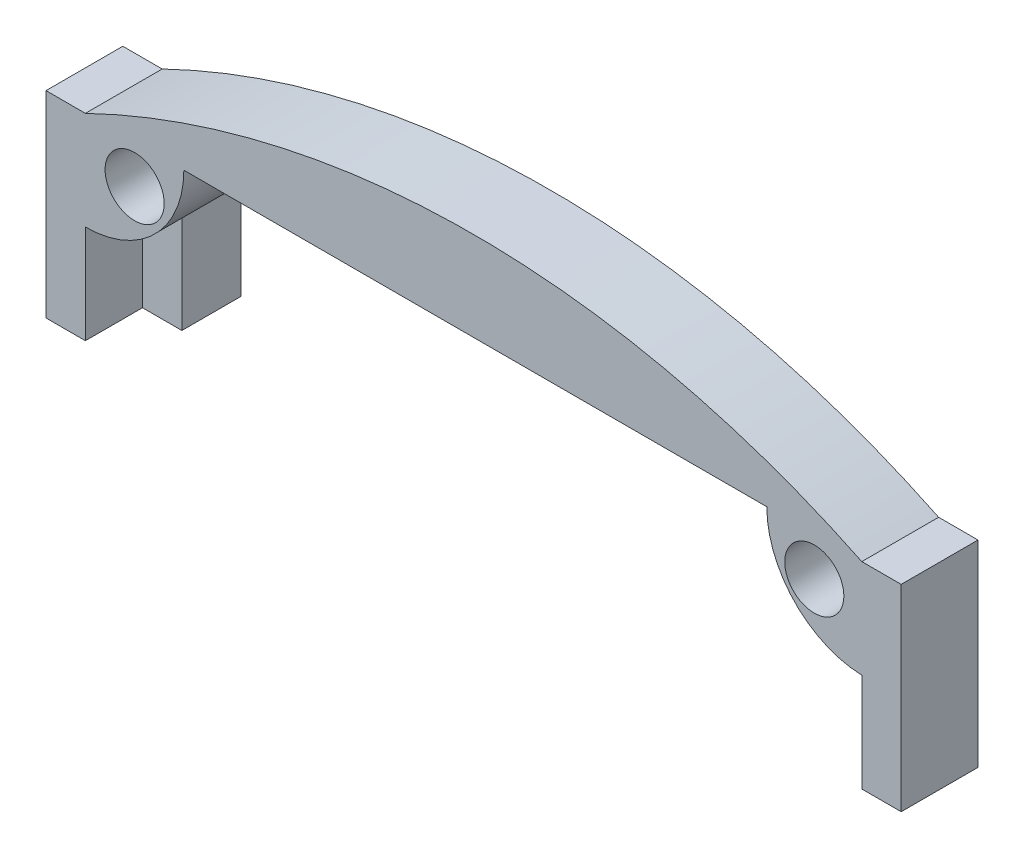
ISO-10303-21;
HEADER;
FILE_DESCRIPTION(('STEP AP214'),'2;1');
FILE_NAME('part.step','',(''),(''),'','','');
FILE_SCHEMA(('AUTOMOTIVE_DESIGN { 1 0 10303 214 1 1 1 1 }'));
ENDSEC;
DATA;
#1=APPLICATION_CONTEXT('core data for automotive mechanical design processes');
#2=APPLICATION_PROTOCOL_DEFINITION('international standard','automotive_design',2000,#1);
#3=PRODUCT_CONTEXT('',#1,'mechanical');
#4=PRODUCT('Part','Part','',(#3));
#5=PRODUCT_RELATED_PRODUCT_CATEGORY('part','',(#4));
#6=PRODUCT_DEFINITION_FORMATION('','',#4);
#7=PRODUCT_DEFINITION_CONTEXT('part definition',#1,'design');
#8=PRODUCT_DEFINITION('design','',#6,#7);
#9=PRODUCT_DEFINITION_SHAPE('','',#8);
#10=(LENGTH_UNIT() NAMED_UNIT(*) SI_UNIT(.MILLI.,.METRE.));
#11=(NAMED_UNIT(*) PLANE_ANGLE_UNIT() SI_UNIT($,.RADIAN.));
#12=(NAMED_UNIT(*) SI_UNIT($,.STERADIAN.) SOLID_ANGLE_UNIT());
#13=UNCERTAINTY_MEASURE_WITH_UNIT(LENGTH_MEASURE(1.E-05),#10,'distance_accuracy_value','');
#14=(GEOMETRIC_REPRESENTATION_CONTEXT(3) GLOBAL_UNCERTAINTY_ASSIGNED_CONTEXT((#13)) GLOBAL_UNIT_ASSIGNED_CONTEXT((#10,
#11,#12)) REPRESENTATION_CONTEXT('',''));
#15=CARTESIAN_POINT('',(0.,0.,0.));
#16=DIRECTION('',(0.,0.,1.));
#17=DIRECTION('',(1.,0.,0.));
#18=AXIS2_PLACEMENT_3D('',#15,#16,#17);
#19=CARTESIAN_POINT('',(0.,0.,-2.));
#20=DIRECTION('',(0.,0.,-1.));
#21=DIRECTION('',(-1.,0.,0.));
#22=AXIS2_PLACEMENT_3D('',#19,#20,#21);
#23=PLANE('',#22);
#24=DIRECTION('',(0.,-1.,0.));
#25=VECTOR('',#24,1.);
#26=CARTESIAN_POINT('',(2.,-5.,-2.));
#27=LINE('',#26,#25);
#28=CARTESIAN_POINT('',(2.,-5.,-2.));
#29=VERTEX_POINT('',#28);
#30=CARTESIAN_POINT('',(2.,-10.,-2.));
#31=VERTEX_POINT('',#30);
#32=EDGE_CURVE('E71',#29,#31,#27,.T.);
#33=ORIENTED_EDGE('',*,*,#32,.T.);
#34=DIRECTION('',(-1.,0.,0.));
#35=VECTOR('',#34,1.);
#36=CARTESIAN_POINT('',(2.,-10.,-2.));
#37=LINE('',#36,#35);
#38=CARTESIAN_POINT('',(0.,-10.,-2.));
#39=VERTEX_POINT('',#38);
#40=EDGE_CURVE('E13',#31,#39,#37,.T.);
#41=ORIENTED_EDGE('',*,*,#40,.T.);
#42=DIRECTION('',(0.,1.,0.));
#43=VECTOR('',#42,1.);
#44=CARTESIAN_POINT('',(0.,-10.,-2.));
#45=LINE('',#44,#43);
#46=CARTESIAN_POINT('',(0.,-5.,-2.));
#47=VERTEX_POINT('',#46);
#48=EDGE_CURVE('E100',#39,#47,#45,.T.);
#49=ORIENTED_EDGE('',*,*,#48,.T.);
#50=DIRECTION('',(1.,0.,0.));
#51=VECTOR('',#50,1.);
#52=CARTESIAN_POINT('',(0.,-5.,-2.));
#53=LINE('',#52,#51);
#54=EDGE_CURVE('E126',#47,#29,#53,.T.);
#55=ORIENTED_EDGE('',*,*,#54,.T.);
#56=EDGE_LOOP('',(#33,#41,#49,#55));
#57=FACE_BOUND('',#56,.T.);
#58=ADVANCED_FACE('F56',(#57),#23,.T.);
#59=CARTESIAN_POINT('',(2.,-5.,0.));
#60=DIRECTION('',(1.,0.,0.));
#61=DIRECTION('',(0.,0.,-1.));
#62=AXIS2_PLACEMENT_3D('',#59,#60,#61);
#63=PLANE('',#62);
#64=ORIENTED_EDGE('',*,*,#32,.F.);
#65=DIRECTION('',(0.,0.,-1.));
#66=VECTOR('',#65,1.);
#67=CARTESIAN_POINT('',(2.,-5.,0.));
#68=LINE('',#67,#66);
#69=CARTESIAN_POINT('',(2.,-5.,1.));
#70=VERTEX_POINT('',#69);
#71=EDGE_CURVE('E127',#70,#29,#68,.T.);
#72=ORIENTED_EDGE('',*,*,#71,.F.);
#73=DIRECTION('',(0.,-1.,0.));
#74=VECTOR('',#73,1.);
#75=CARTESIAN_POINT('',(2.,-5.,1.));
#76=LINE('',#75,#74);
#77=CARTESIAN_POINT('',(2.,-10.,1.));
#78=VERTEX_POINT('',#77);
#79=EDGE_CURVE('E116',#70,#78,#76,.T.);
#80=ORIENTED_EDGE('',*,*,#79,.T.);
#81=DIRECTION('',(0.,0.,-1.));
#82=VECTOR('',#81,1.);
#83=CARTESIAN_POINT('',(2.,-10.,0.));
#84=LINE('',#83,#82);
#85=EDGE_CURVE('E107',#78,#31,#84,.T.);
#86=ORIENTED_EDGE('',*,*,#85,.T.);
#87=EDGE_LOOP('',(#64,#72,#80,#86));
#88=FACE_BOUND('',#87,.T.);
#89=ADVANCED_FACE('F151',(#88),#63,.T.);
#90=CARTESIAN_POINT('',(0.,-5.,0.));
#91=DIRECTION('',(0.,1.,0.));
#92=DIRECTION('',(0.,0.,1.));
#93=AXIS2_PLACEMENT_3D('',#90,#91,#92);
#94=PLANE('',#93);
#95=ORIENTED_EDGE('',*,*,#54,.F.);
#96=DIRECTION('',(0.,0.,-1.));
#97=VECTOR('',#96,1.);
#98=CARTESIAN_POINT('',(0.,-5.,0.));
#99=LINE('',#98,#97);
#100=CARTESIAN_POINT('',(0.,-5.,1.));
#101=VERTEX_POINT('',#100);
#102=EDGE_CURVE('E138',#101,#47,#99,.T.);
#103=ORIENTED_EDGE('',*,*,#102,.F.);
#104=DIRECTION('',(1.,0.,0.));
#105=VECTOR('',#104,1.);
#106=CARTESIAN_POINT('',(0.,-5.,1.));
#107=LINE('',#106,#105);
#108=EDGE_CURVE('E114',#101,#70,#107,.T.);
#109=ORIENTED_EDGE('',*,*,#108,.T.);
#110=ORIENTED_EDGE('',*,*,#71,.T.);
#111=EDGE_LOOP('',(#95,#103,#109,#110));
#112=FACE_BOUND('',#111,.T.);
#113=ADVANCED_FACE('F149',(#112),#94,.T.);
#114=CARTESIAN_POINT('',(0.,-10.,0.));
#115=DIRECTION('',(-1.,0.,0.));
#116=DIRECTION('',(0.,0.,1.));
#117=AXIS2_PLACEMENT_3D('',#114,#115,#116);
#118=PLANE('',#117);
#119=ORIENTED_EDGE('',*,*,#48,.F.);
#120=DIRECTION('',(0.,0.,-1.));
#121=VECTOR('',#120,1.);
#122=CARTESIAN_POINT('',(0.,-10.,0.));
#123=LINE('',#122,#121);
#124=CARTESIAN_POINT('',(0.,-10.,1.));
#125=VERTEX_POINT('',#124);
#126=EDGE_CURVE('E65',#125,#39,#123,.T.);
#127=ORIENTED_EDGE('',*,*,#126,.F.);
#128=DIRECTION('',(0.,1.,0.));
#129=VECTOR('',#128,1.);
#130=CARTESIAN_POINT('',(0.,-10.,1.));
#131=LINE('',#130,#129);
#132=EDGE_CURVE('E98',#125,#101,#131,.T.);
#133=ORIENTED_EDGE('',*,*,#132,.T.);
#134=ORIENTED_EDGE('',*,*,#102,.T.);
#135=EDGE_LOOP('',(#119,#127,#133,#134));
#136=FACE_BOUND('',#135,.T.);
#137=ADVANCED_FACE('F95',(#136),#118,.T.);
#138=CARTESIAN_POINT('',(2.,-10.,0.));
#139=DIRECTION('',(0.,-1.,0.));
#140=DIRECTION('',(0.,0.,-1.));
#141=AXIS2_PLACEMENT_3D('',#138,#139,#140);
#142=PLANE('',#141);
#143=ORIENTED_EDGE('',*,*,#40,.F.);
#144=ORIENTED_EDGE('',*,*,#85,.F.);
#145=DIRECTION('',(-1.,0.,0.));
#146=VECTOR('',#145,1.);
#147=CARTESIAN_POINT('',(2.,-10.,1.));
#148=LINE('',#147,#146);
#149=EDGE_CURVE('E105',#78,#125,#148,.T.);
#150=ORIENTED_EDGE('',*,*,#149,.T.);
#151=ORIENTED_EDGE('',*,*,#126,.T.);
#152=EDGE_LOOP('',(#143,#144,#150,#151));
#153=FACE_BOUND('',#152,.T.);
#154=ADVANCED_FACE('F106',(#153),#142,.T.);
#155=CARTESIAN_POINT('',(0.,0.,1.));
#156=DIRECTION('',(0.,0.,-1.));
#157=DIRECTION('',(-1.,0.,0.));
#158=AXIS2_PLACEMENT_3D('',#155,#156,#157);
#159=PLANE('',#158);
#160=ORIENTED_EDGE('',*,*,#79,.F.);
#161=ORIENTED_EDGE('',*,*,#108,.F.);
#162=ORIENTED_EDGE('',*,*,#132,.F.);
#163=ORIENTED_EDGE('',*,*,#149,.F.);
#164=EDGE_LOOP('',(#160,#161,#162,#163));
#165=FACE_BOUND('',#164,.T.);
#166=ADVANCED_FACE('F112',(#165),#159,.F.);
#167=CLOSED_SHELL('',(#58,#89,#113,#137,#154,#166));
#168=MANIFOLD_SOLID_BREP('B2',#167);
#169=CARTESIAN_POINT('',(0.,0.,-2.));
#170=DIRECTION('',(0.,0.,-1.));
#171=DIRECTION('',(-1.,0.,0.));
#172=AXIS2_PLACEMENT_3D('',#169,#170,#171);
#173=PLANE('',#172);
#174=DIRECTION('',(0.,1.,0.));
#175=VECTOR('',#174,1.);
#176=CARTESIAN_POINT('',(39.4233040702315,-10.,-2.));
#177=LINE('',#176,#175);
#178=CARTESIAN_POINT('',(39.4233040702315,-10.,-2.));
#179=VERTEX_POINT('',#178);
#180=CARTESIAN_POINT('',(39.4233040702315,-4.99687687945213,-2.));
#181=VERTEX_POINT('',#180);
#182=EDGE_CURVE('E54',#179,#181,#177,.T.);
#183=ORIENTED_EDGE('',*,*,#182,.F.);
#184=DIRECTION('',(1.,0.,0.));
#185=VECTOR('',#184,1.);
#186=CARTESIAN_POINT('',(37.6,-10.,-2.));
#187=LINE('',#186,#185);
#188=CARTESIAN_POINT('',(37.6,-10.,-2.));
#189=VERTEX_POINT('',#188);
#190=EDGE_CURVE('E229',#189,#179,#187,.T.);
#191=ORIENTED_EDGE('',*,*,#190,.F.);
#192=DIRECTION('',(0.,-1.,0.));
#193=VECTOR('',#192,1.);
#194=CARTESIAN_POINT('',(37.6,-4.99687687945213,-2.));
#195=LINE('',#194,#193);
#196=CARTESIAN_POINT('',(37.6,-4.99687687945213,-2.));
#197=VERTEX_POINT('',#196);
#198=EDGE_CURVE('E285',#197,#189,#195,.T.);
#199=ORIENTED_EDGE('',*,*,#198,.F.);
#200=DIRECTION('',(-1.,0.,0.));
#201=VECTOR('',#200,1.);
#202=CARTESIAN_POINT('',(39.4233040702315,-4.99687687945213,-2.));
#203=LINE('',#202,#201);
#204=EDGE_CURVE('E258',#181,#197,#203,.T.);
#205=ORIENTED_EDGE('',*,*,#204,.F.);
#206=EDGE_LOOP('',(#183,#191,#199,#205));
#207=FACE_BOUND('',#206,.T.);
#208=ADVANCED_FACE('F213',(#207),#173,.T.);
#209=CARTESIAN_POINT('',(37.6,-10.,0.));
#210=DIRECTION('',(0.,1.,0.));
#211=DIRECTION('',(0.,0.,1.));
#212=AXIS2_PLACEMENT_3D('',#209,#210,#211);
#213=PLANE('',#212);
#214=ORIENTED_EDGE('',*,*,#190,.T.);
#215=DIRECTION('',(0.,0.,-1.));
#216=VECTOR('',#215,1.);
#217=CARTESIAN_POINT('',(39.4233040702315,-10.,0.));
#218=LINE('',#217,#216);
#219=CARTESIAN_POINT('',(39.4233040702315,-10.,1.));
#220=VERTEX_POINT('',#219);
#221=EDGE_CURVE('E283',#220,#179,#218,.T.);
#222=ORIENTED_EDGE('',*,*,#221,.F.);
#223=DIRECTION('',(1.,0.,0.));
#224=VECTOR('',#223,1.);
#225=CARTESIAN_POINT('',(37.6,-10.,1.));
#226=LINE('',#225,#224);
#227=CARTESIAN_POINT('',(37.6,-10.,1.));
#228=VERTEX_POINT('',#227);
#229=EDGE_CURVE('E268',#228,#220,#226,.T.);
#230=ORIENTED_EDGE('',*,*,#229,.F.);
#231=DIRECTION('',(0.,0.,-1.));
#232=VECTOR('',#231,1.);
#233=CARTESIAN_POINT('',(37.6,-10.,0.));
#234=LINE('',#233,#232);
#235=EDGE_CURVE('E286',#228,#189,#234,.T.);
#236=ORIENTED_EDGE('',*,*,#235,.T.);
#237=EDGE_LOOP('',(#214,#222,#230,#236));
#238=FACE_BOUND('',#237,.T.);
#239=ADVANCED_FACE('F304',(#238),#213,.F.);
#240=CARTESIAN_POINT('',(37.6,-4.99687687945213,0.));
#241=DIRECTION('',(1.,0.,0.));
#242=DIRECTION('',(0.,0.,-1.));
#243=AXIS2_PLACEMENT_3D('',#240,#241,#242);
#244=PLANE('',#243);
#245=ORIENTED_EDGE('',*,*,#198,.T.);
#246=ORIENTED_EDGE('',*,*,#235,.F.);
#247=DIRECTION('',(0.,-1.,0.));
#248=VECTOR('',#247,1.);
#249=CARTESIAN_POINT('',(37.6,-4.99687687945213,1.));
#250=LINE('',#249,#248);
#251=CARTESIAN_POINT('',(37.6,-4.99687687945213,1.));
#252=VERTEX_POINT('',#251);
#253=EDGE_CURVE('E273',#252,#228,#250,.T.);
#254=ORIENTED_EDGE('',*,*,#253,.F.);
#255=DIRECTION('',(0.,0.,-1.));
#256=VECTOR('',#255,1.);
#257=CARTESIAN_POINT('',(37.6,-4.99687687945213,0.));
#258=LINE('',#257,#256);
#259=EDGE_CURVE('E272',#252,#197,#258,.T.);
#260=ORIENTED_EDGE('',*,*,#259,.T.);
#261=EDGE_LOOP('',(#245,#246,#254,#260));
#262=FACE_BOUND('',#261,.T.);
#263=ADVANCED_FACE('F308',(#262),#244,.F.);
#264=CARTESIAN_POINT('',(39.4233040702315,-4.99687687945213,0.));
#265=DIRECTION('',(0.,-1.,0.));
#266=DIRECTION('',(0.,0.,-1.));
#267=AXIS2_PLACEMENT_3D('',#264,#265,#266);
#268=PLANE('',#267);
#269=ORIENTED_EDGE('',*,*,#204,.T.);
#270=ORIENTED_EDGE('',*,*,#259,.F.);
#271=DIRECTION('',(-1.,0.,0.));
#272=VECTOR('',#271,1.);
#273=CARTESIAN_POINT('',(39.4233040702315,-4.99687687945213,1.));
#274=LINE('',#273,#272);
#275=CARTESIAN_POINT('',(39.4233040702315,-4.99687687945213,1.));
#276=VERTEX_POINT('',#275);
#277=EDGE_CURVE('E265',#276,#252,#274,.T.);
#278=ORIENTED_EDGE('',*,*,#277,.F.);
#279=DIRECTION('',(0.,0.,-1.));
#280=VECTOR('',#279,1.);
#281=CARTESIAN_POINT('',(39.4233040702315,-4.99687687945213,0.));
#282=LINE('',#281,#280);
#283=EDGE_CURVE('E222',#276,#181,#282,.T.);
#284=ORIENTED_EDGE('',*,*,#283,.T.);
#285=EDGE_LOOP('',(#269,#270,#278,#284));
#286=FACE_BOUND('',#285,.T.);
#287=ADVANCED_FACE('F270',(#286),#268,.F.);
#288=CARTESIAN_POINT('',(39.4233040702315,-10.,0.));
#289=DIRECTION('',(-1.,0.,0.));
#290=DIRECTION('',(0.,0.,1.));
#291=AXIS2_PLACEMENT_3D('',#288,#289,#290);
#292=PLANE('',#291);
#293=ORIENTED_EDGE('',*,*,#182,.T.);
#294=ORIENTED_EDGE('',*,*,#283,.F.);
#295=DIRECTION('',(0.,1.,0.));
#296=VECTOR('',#295,1.);
#297=CARTESIAN_POINT('',(39.4233040702315,-10.,1.));
#298=LINE('',#297,#296);
#299=EDGE_CURVE('E253',#220,#276,#298,.T.);
#300=ORIENTED_EDGE('',*,*,#299,.F.);
#301=ORIENTED_EDGE('',*,*,#221,.T.);
#302=EDGE_LOOP('',(#293,#294,#300,#301));
#303=FACE_BOUND('',#302,.T.);
#304=ADVANCED_FACE('F252',(#303),#292,.F.);
#305=CARTESIAN_POINT('',(0.,0.,1.));
#306=DIRECTION('',(0.,0.,-1.));
#307=DIRECTION('',(-1.,0.,0.));
#308=AXIS2_PLACEMENT_3D('',#305,#306,#307);
#309=PLANE('',#308);
#310=ORIENTED_EDGE('',*,*,#299,.T.);
#311=ORIENTED_EDGE('',*,*,#277,.T.);
#312=ORIENTED_EDGE('',*,*,#253,.T.);
#313=ORIENTED_EDGE('',*,*,#229,.T.);
#314=EDGE_LOOP('',(#310,#311,#312,#313));
#315=FACE_BOUND('',#314,.T.);
#316=ADVANCED_FACE('F263',(#315),#309,.F.);
#317=CLOSED_SHELL('',(#208,#239,#263,#287,#304,#316));
#318=MANIFOLD_SOLID_BREP('B7',#317);
#319=CARTESIAN_POINT('',(19.7116520351157,-40.5877154670908,3.9));
#320=DIRECTION('',(0.,0.,-1.));
#321=DIRECTION('',(-1.,0.,0.));
#322=AXIS2_PLACEMENT_3D('',#319,#320,#321);
#323=CYLINDRICAL_SURFACE('',#322,45.1210801376807);
#324=CARTESIAN_POINT('',(19.7116520351157,-40.5877154670908,0.));
#325=DIRECTION('',(0.,0.,1.));
#326=DIRECTION('',(1.,0.,0.));
#327=AXIS2_PLACEMENT_3D('',#324,#325,#326);
#328=CIRCLE('',#327,45.1210801376807);
#329=CARTESIAN_POINT('',(0.,0.,0.));
#330=VERTEX_POINT('',#329);
#331=CARTESIAN_POINT('',(39.4233040702315,0.,0.));
#332=VERTEX_POINT('',#331);
#333=EDGE_CURVE('E464',#330,#332,#328,.F.);
#334=ORIENTED_EDGE('',*,*,#333,.F.);
#335=DIRECTION('',(0.,0.,-1.));
#336=VECTOR('',#335,1.);
#337=CARTESIAN_POINT('',(0.,0.,3.9));
#338=LINE('',#337,#336);
#339=CARTESIAN_POINT('',(0.,0.,3.9));
#340=VERTEX_POINT('',#339);
#341=EDGE_CURVE('E211',#340,#330,#338,.T.);
#342=ORIENTED_EDGE('',*,*,#341,.F.);
#343=CARTESIAN_POINT('',(19.7116520351157,-40.5877154670908,3.9));
#344=DIRECTION('',(0.,0.,1.));
#345=DIRECTION('',(1.,0.,0.));
#346=AXIS2_PLACEMENT_3D('',#343,#344,#345);
#347=CIRCLE('',#346,45.1210801376807);
#348=CARTESIAN_POINT('',(39.4233040702315,0.,3.9));
#349=VERTEX_POINT('',#348);
#350=EDGE_CURVE('E379',#340,#349,#347,.F.);
#351=ORIENTED_EDGE('',*,*,#350,.T.);
#352=DIRECTION('',(0.,0.,-1.));
#353=VECTOR('',#352,1.);
#354=CARTESIAN_POINT('',(39.4233040702315,0.,3.9));
#355=LINE('',#354,#353);
#356=EDGE_CURVE('E402',#349,#332,#355,.T.);
#357=ORIENTED_EDGE('',*,*,#356,.T.);
#358=EDGE_LOOP('',(#334,#342,#351,#357));
#359=FACE_BOUND('',#358,.T.);
#360=ADVANCED_FACE('F361',(#359),#323,.T.);
#361=CARTESIAN_POINT('',(0.,0.,3.9));
#362=DIRECTION('',(0.,0.,-1.));
#363=DIRECTION('',(-1.,0.,0.));
#364=AXIS2_PLACEMENT_3D('',#361,#362,#363);
#365=CYLINDRICAL_SURFACE('',#364,5.);
#366=CARTESIAN_POINT('',(0.,0.,0.));
#367=DIRECTION('',(0.,0.,1.));
#368=DIRECTION('',(1.,0.,0.));
#369=AXIS2_PLACEMENT_3D('',#366,#367,#368);
#370=CIRCLE('',#369,5.);
#371=CARTESIAN_POINT('',(0.,-5.,0.));
#372=VERTEX_POINT('',#371);
#373=CARTESIAN_POINT('',(5.,0.,0.));
#374=VERTEX_POINT('',#373);
#375=EDGE_CURVE('E477',#372,#374,#370,.T.);
#376=ORIENTED_EDGE('',*,*,#375,.T.);
#377=DIRECTION('',(0.,0.,-1.));
#378=VECTOR('',#377,1.);
#379=CARTESIAN_POINT('',(5.,0.,3.9));
#380=LINE('',#379,#378);
#381=CARTESIAN_POINT('',(5.,0.,3.9));
#382=VERTEX_POINT('',#381);
#383=EDGE_CURVE('E504',#382,#374,#380,.T.);
#384=ORIENTED_EDGE('',*,*,#383,.F.);
#385=CARTESIAN_POINT('',(0.,0.,3.9));
#386=DIRECTION('',(0.,0.,1.));
#387=DIRECTION('',(1.,0.,0.));
#388=AXIS2_PLACEMENT_3D('',#385,#386,#387);
#389=CIRCLE('',#388,5.);
#390=CARTESIAN_POINT('',(0.,-5.,3.9));
#391=VERTEX_POINT('',#390);
#392=EDGE_CURVE('E410',#391,#382,#389,.T.);
#393=ORIENTED_EDGE('',*,*,#392,.F.);
#394=DIRECTION('',(0.,0.,-1.));
#395=VECTOR('',#394,1.);
#396=CARTESIAN_POINT('',(0.,-5.,3.9));
#397=LINE('',#396,#395);
#398=EDGE_CURVE('E371',#391,#372,#397,.T.);
#399=ORIENTED_EDGE('',*,*,#398,.T.);
#400=EDGE_LOOP('',(#376,#384,#393,#399));
#401=FACE_BOUND('',#400,.T.);
#402=ADVANCED_FACE('F660',(#401),#365,.T.);
#403=CARTESIAN_POINT('',(0.,0.,3.9));
#404=DIRECTION('',(0.,1.,0.));
#405=DIRECTION('',(0.,0.,1.));
#406=AXIS2_PLACEMENT_3D('',#403,#404,#405);
#407=PLANE('',#406);
#408=DIRECTION('',(1.,0.,0.));
#409=VECTOR('',#408,1.);
#410=CARTESIAN_POINT('',(0.,0.,0.));
#411=LINE('',#410,#409);
#412=CARTESIAN_POINT('',(34.6,0.,0.));
#413=VERTEX_POINT('',#412);
#414=EDGE_CURVE('E482',#374,#413,#411,.T.);
#415=ORIENTED_EDGE('',*,*,#414,.T.);
#416=DIRECTION('',(0.,0.,-1.));
#417=VECTOR('',#416,1.);
#418=CARTESIAN_POINT('',(34.6,0.,3.9));
#419=LINE('',#418,#417);
#420=CARTESIAN_POINT('',(34.6,0.,3.9));
#421=VERTEX_POINT('',#420);
#422=EDGE_CURVE('E398',#421,#413,#419,.T.);
#423=ORIENTED_EDGE('',*,*,#422,.F.);
#424=DIRECTION('',(1.,0.,0.));
#425=VECTOR('',#424,1.);
#426=CARTESIAN_POINT('',(0.,0.,3.9));
#427=LINE('',#426,#425);
#428=EDGE_CURVE('E536',#382,#421,#427,.T.);
#429=ORIENTED_EDGE('',*,*,#428,.F.);
#430=ORIENTED_EDGE('',*,*,#383,.T.);
#431=EDGE_LOOP('',(#415,#423,#429,#430));
#432=FACE_BOUND('',#431,.T.);
#433=ADVANCED_FACE('F665',(#432),#407,.F.);
#434=CARTESIAN_POINT('',(39.6,0.,3.9));
#435=DIRECTION('',(0.,0.,-1.));
#436=DIRECTION('',(-1.,0.,0.));
#437=AXIS2_PLACEMENT_3D('',#434,#435,#436);
#438=CYLINDRICAL_SURFACE('',#437,5.);
#439=CARTESIAN_POINT('',(39.6,0.,0.));
#440=DIRECTION('',(0.,0.,1.));
#441=DIRECTION('',(1.,0.,0.));
#442=AXIS2_PLACEMENT_3D('',#439,#440,#441);
#443=CIRCLE('',#442,5.);
#444=CARTESIAN_POINT('',(39.4233040702315,-4.99687687945213,0.));
#445=VERTEX_POINT('',#444);
#446=EDGE_CURVE('E520',#445,#413,#443,.F.);
#447=ORIENTED_EDGE('',*,*,#446,.F.);
#448=DIRECTION('',(0.,0.,-1.));
#449=VECTOR('',#448,1.);
#450=CARTESIAN_POINT('',(39.4233040702315,-4.99687687945213,3.9));
#451=LINE('',#450,#449);
#452=CARTESIAN_POINT('',(39.4233040702315,-4.99687687945213,3.9));
#453=VERTEX_POINT('',#452);
#454=EDGE_CURVE('E499',#453,#445,#451,.T.);
#455=ORIENTED_EDGE('',*,*,#454,.F.);
#456=CARTESIAN_POINT('',(39.6,0.,3.9));
#457=DIRECTION('',(0.,0.,1.));
#458=DIRECTION('',(1.,0.,0.));
#459=AXIS2_PLACEMENT_3D('',#456,#457,#458);
#460=CIRCLE('',#459,5.);
#461=EDGE_CURVE('E533',#453,#421,#460,.F.);
#462=ORIENTED_EDGE('',*,*,#461,.T.);
#463=ORIENTED_EDGE('',*,*,#422,.T.);
#464=EDGE_LOOP('',(#447,#455,#462,#463));
#465=FACE_BOUND('',#464,.T.);
#466=ADVANCED_FACE('F700',(#465),#438,.T.);
#467=CARTESIAN_POINT('',(37.0116520351157,-1.97200037528807,3.9));
#468=DIRECTION('',(0.,0.,-1.));
#469=DIRECTION('',(-1.,0.,0.));
#470=AXIS2_PLACEMENT_3D('',#467,#468,#469);
#471=CYLINDRICAL_SURFACE('',#470,1.5);
#472=CARTESIAN_POINT('',(37.0116520351157,-1.97200037528807,3.9));
#473=DIRECTION('',(0.,0.,1.));
#474=DIRECTION('',(1.,0.,0.));
#475=AXIS2_PLACEMENT_3D('',#472,#473,#474);
#476=CIRCLE('',#475,1.5);
#477=CARTESIAN_POINT('',(38.5116520351157,-1.97200037528807,3.9));
#478=VERTEX_POINT('',#477);
#479=EDGE_CURVE('E529',#478,#478,#476,.T.);
#480=ORIENTED_EDGE('',*,*,#479,.T.);
#481=EDGE_LOOP('',(#480));
#482=FACE_BOUND('',#481,.T.);
#483=CARTESIAN_POINT('',(37.0116520351157,-1.97200037528807,0.));
#484=DIRECTION('',(0.,0.,1.));
#485=DIRECTION('',(1.,0.,0.));
#486=AXIS2_PLACEMENT_3D('',#483,#484,#485);
#487=CIRCLE('',#486,1.5);
#488=CARTESIAN_POINT('',(38.5116520351157,-1.97200037528807,0.));
#489=VERTEX_POINT('',#488);
#490=EDGE_CURVE('E516',#489,#489,#487,.T.);
#491=ORIENTED_EDGE('',*,*,#490,.F.);
#492=EDGE_LOOP('',(#491));
#493=FACE_BOUND('',#492,.T.);
#494=ADVANCED_FACE('F705',(#482,#493),#471,.F.);
#495=CARTESIAN_POINT('',(2.5,-1.97200037528807,3.9));
#496=DIRECTION('',(0.,0.,-1.));
#497=DIRECTION('',(-1.,0.,0.));
#498=AXIS2_PLACEMENT_3D('',#495,#496,#497);
#499=CYLINDRICAL_SURFACE('',#498,1.5);
#500=CARTESIAN_POINT('',(2.5,-1.97200037528807,3.9));
#501=DIRECTION('',(0.,0.,1.));
#502=DIRECTION('',(1.,0.,0.));
#503=AXIS2_PLACEMENT_3D('',#500,#501,#502);
#504=CIRCLE('',#503,1.5);
#505=CARTESIAN_POINT('',(4.,-1.97200037528807,3.9));
#506=VERTEX_POINT('',#505);
#507=EDGE_CURVE('E500',#506,#506,#504,.T.);
#508=ORIENTED_EDGE('',*,*,#507,.T.);
#509=EDGE_LOOP('',(#508));
#510=FACE_BOUND('',#509,.T.);
#511=CARTESIAN_POINT('',(2.5,-1.97200037528807,0.));
#512=DIRECTION('',(0.,0.,1.));
#513=DIRECTION('',(1.,0.,0.));
#514=AXIS2_PLACEMENT_3D('',#511,#512,#513);
#515=CIRCLE('',#514,1.5);
#516=CARTESIAN_POINT('',(4.,-1.97200037528807,0.));
#517=VERTEX_POINT('',#516);
#518=EDGE_CURVE('E494',#517,#517,#515,.T.);
#519=ORIENTED_EDGE('',*,*,#518,.F.);
#520=EDGE_LOOP('',(#519));
#521=FACE_BOUND('',#520,.T.);
#522=ADVANCED_FACE('F708',(#510,#521),#499,.F.);
#523=CARTESIAN_POINT('',(0.,0.,3.9));
#524=DIRECTION('',(0.,0.,1.));
#525=DIRECTION('',(1.,0.,0.));
#526=AXIS2_PLACEMENT_3D('',#523,#524,#525);
#527=PLANE('',#526);
#528=ORIENTED_EDGE('',*,*,#350,.F.);
#529=DIRECTION('',(-1.,0.,0.));
#530=VECTOR('',#529,1.);
#531=CARTESIAN_POINT('',(0.,0.,3.9));
#532=LINE('',#531,#530);
#533=CARTESIAN_POINT('',(-2.,0.,3.9));
#534=VERTEX_POINT('',#533);
#535=EDGE_CURVE('E473',#340,#534,#532,.T.);
#536=ORIENTED_EDGE('',*,*,#535,.T.);
#537=DIRECTION('',(0.,-1.,0.));
#538=VECTOR('',#537,1.);
#539=CARTESIAN_POINT('',(-2.,0.,3.9));
#540=LINE('',#539,#538);
#541=CARTESIAN_POINT('',(-2.,-10.,3.9));
#542=VERTEX_POINT('',#541);
#543=EDGE_CURVE('E609',#534,#542,#540,.T.);
#544=ORIENTED_EDGE('',*,*,#543,.T.);
#545=DIRECTION('',(1.,0.,0.));
#546=VECTOR('',#545,1.);
#547=CARTESIAN_POINT('',(-2.,-10.,3.9));
#548=LINE('',#547,#546);
#549=CARTESIAN_POINT('',(0.,-10.,3.9));
#550=VERTEX_POINT('',#549);
#551=EDGE_CURVE('E606',#542,#550,#548,.T.);
#552=ORIENTED_EDGE('',*,*,#551,.T.);
#553=DIRECTION('',(0.,1.,0.));
#554=VECTOR('',#553,1.);
#555=CARTESIAN_POINT('',(0.,-10.,3.9));
#556=LINE('',#555,#554);
#557=EDGE_CURVE('E472',#550,#391,#556,.T.);
#558=ORIENTED_EDGE('',*,*,#557,.T.);
#559=ORIENTED_EDGE('',*,*,#392,.T.);
#560=ORIENTED_EDGE('',*,*,#428,.T.);
#561=ORIENTED_EDGE('',*,*,#461,.F.);
#562=DIRECTION('',(0.,1.,0.));
#563=VECTOR('',#562,1.);
#564=CARTESIAN_POINT('',(39.4233040702315,-10.,3.9));
#565=LINE('',#564,#563);
#566=CARTESIAN_POINT('',(39.4233040702315,-10.,3.9));
#567=VERTEX_POINT('',#566);
#568=EDGE_CURVE('E485',#567,#453,#565,.T.);
#569=ORIENTED_EDGE('',*,*,#568,.F.);
#570=DIRECTION('',(-1.,0.,0.));
#571=VECTOR('',#570,1.);
#572=CARTESIAN_POINT('',(41.4233040702315,-10.,3.9));
#573=LINE('',#572,#571);
#574=CARTESIAN_POINT('',(41.4233040702315,-10.,3.9));
#575=VERTEX_POINT('',#574);
#576=EDGE_CURVE('E548',#575,#567,#573,.T.);
#577=ORIENTED_EDGE('',*,*,#576,.F.);
#578=DIRECTION('',(0.,-1.,0.));
#579=VECTOR('',#578,1.);
#580=CARTESIAN_POINT('',(41.4233040702315,0.,3.9));
#581=LINE('',#580,#579);
#582=CARTESIAN_POINT('',(41.4233040702315,0.,3.9));
#583=VERTEX_POINT('',#582);
#584=EDGE_CURVE('E551',#583,#575,#581,.T.);
#585=ORIENTED_EDGE('',*,*,#584,.F.);
#586=DIRECTION('',(1.,0.,0.));
#587=VECTOR('',#586,1.);
#588=CARTESIAN_POINT('',(39.4233040702315,0.,3.9));
#589=LINE('',#588,#587);
#590=EDGE_CURVE('E562',#349,#583,#589,.T.);
#591=ORIENTED_EDGE('',*,*,#590,.F.);
#592=EDGE_LOOP('',(#528,#536,#544,#552,#558,#559,#560,#561,#569,#577,#585,#591));
#593=FACE_BOUND('',#592,.T.);
#594=ORIENTED_EDGE('',*,*,#479,.F.);
#595=EDGE_LOOP('',(#594));
#596=FACE_BOUND('',#595,.T.);
#597=ORIENTED_EDGE('',*,*,#507,.F.);
#598=EDGE_LOOP('',(#597));
#599=FACE_BOUND('',#598,.T.);
#600=ADVANCED_FACE('F657',(#593,#596,#599),#527,.T.);
#601=CARTESIAN_POINT('',(0.,0.,0.));
#602=DIRECTION('',(0.,0.,1.));
#603=DIRECTION('',(1.,0.,0.));
#604=AXIS2_PLACEMENT_3D('',#601,#602,#603);
#605=PLANE('',#604);
#606=ORIENTED_EDGE('',*,*,#333,.T.);
#607=DIRECTION('',(1.,0.,0.));
#608=VECTOR('',#607,1.);
#609=CARTESIAN_POINT('',(39.4233040702315,0.,0.));
#610=LINE('',#609,#608);
#611=CARTESIAN_POINT('',(41.4233040702315,0.,0.));
#612=VERTEX_POINT('',#611);
#613=EDGE_CURVE('E572',#332,#612,#610,.T.);
#614=ORIENTED_EDGE('',*,*,#613,.T.);
#615=DIRECTION('',(0.,-1.,0.));
#616=VECTOR('',#615,1.);
#617=CARTESIAN_POINT('',(41.4233040702315,0.,0.));
#618=LINE('',#617,#616);
#619=CARTESIAN_POINT('',(41.4233040702315,-10.,0.));
#620=VERTEX_POINT('',#619);
#621=EDGE_CURVE('E558',#612,#620,#618,.T.);
#622=ORIENTED_EDGE('',*,*,#621,.T.);
#623=DIRECTION('',(-1.,0.,0.));
#624=VECTOR('',#623,1.);
#625=CARTESIAN_POINT('',(41.4233040702315,-10.,0.));
#626=LINE('',#625,#624);
#627=CARTESIAN_POINT('',(39.4233040702315,-10.,0.));
#628=VERTEX_POINT('',#627);
#629=EDGE_CURVE('E547',#620,#628,#626,.T.);
#630=ORIENTED_EDGE('',*,*,#629,.T.);
#631=DIRECTION('',(0.,1.,0.));
#632=VECTOR('',#631,1.);
#633=CARTESIAN_POINT('',(39.4233040702315,-10.,0.));
#634=LINE('',#633,#632);
#635=EDGE_CURVE('E478',#628,#445,#634,.T.);
#636=ORIENTED_EDGE('',*,*,#635,.T.);
#637=ORIENTED_EDGE('',*,*,#446,.T.);
#638=ORIENTED_EDGE('',*,*,#414,.F.);
#639=ORIENTED_EDGE('',*,*,#375,.F.);
#640=DIRECTION('',(0.,1.,0.));
#641=VECTOR('',#640,1.);
#642=CARTESIAN_POINT('',(0.,-10.,0.));
#643=LINE('',#642,#641);
#644=CARTESIAN_POINT('',(0.,-10.,0.));
#645=VERTEX_POINT('',#644);
#646=EDGE_CURVE('E582',#645,#372,#643,.T.);
#647=ORIENTED_EDGE('',*,*,#646,.F.);
#648=DIRECTION('',(1.,0.,0.));
#649=VECTOR('',#648,1.);
#650=CARTESIAN_POINT('',(-2.,-10.,0.));
#651=LINE('',#650,#649);
#652=CARTESIAN_POINT('',(-2.,-10.,0.));
#653=VERTEX_POINT('',#652);
#654=EDGE_CURVE('E605',#653,#645,#651,.T.);
#655=ORIENTED_EDGE('',*,*,#654,.F.);
#656=DIRECTION('',(0.,-1.,0.));
#657=VECTOR('',#656,1.);
#658=CARTESIAN_POINT('',(-2.,0.,0.));
#659=LINE('',#658,#657);
#660=CARTESIAN_POINT('',(-2.,0.,0.));
#661=VERTEX_POINT('',#660);
#662=EDGE_CURVE('E467',#661,#653,#659,.T.);
#663=ORIENTED_EDGE('',*,*,#662,.F.);
#664=DIRECTION('',(-1.,0.,0.));
#665=VECTOR('',#664,1.);
#666=CARTESIAN_POINT('',(0.,0.,0.));
#667=LINE('',#666,#665);
#668=EDGE_CURVE('E460',#330,#661,#667,.T.);
#669=ORIENTED_EDGE('',*,*,#668,.F.);
#670=EDGE_LOOP('',(#606,#614,#622,#630,#636,#637,#638,#639,#647,#655,#663,#669));
#671=FACE_BOUND('',#670,.T.);
#672=ORIENTED_EDGE('',*,*,#490,.T.);
#673=EDGE_LOOP('',(#672));
#674=FACE_BOUND('',#673,.T.);
#675=ORIENTED_EDGE('',*,*,#518,.T.);
#676=EDGE_LOOP('',(#675));
#677=FACE_BOUND('',#676,.T.);
#678=ADVANCED_FACE('F461',(#671,#674,#677),#605,.F.);
#679=CARTESIAN_POINT('',(39.4233040702315,-10.,0.));
#680=DIRECTION('',(1.,0.,0.));
#681=DIRECTION('',(0.,0.,-1.));
#682=AXIS2_PLACEMENT_3D('',#679,#680,#681);
#683=PLANE('',#682);
#684=ORIENTED_EDGE('',*,*,#568,.T.);
#685=ORIENTED_EDGE('',*,*,#454,.T.);
#686=ORIENTED_EDGE('',*,*,#635,.F.);
#687=DIRECTION('',(0.,0.,1.));
#688=VECTOR('',#687,1.);
#689=CARTESIAN_POINT('',(39.4233040702315,-10.,0.));
#690=LINE('',#689,#688);
#691=EDGE_CURVE('E555',#628,#567,#690,.T.);
#692=ORIENTED_EDGE('',*,*,#691,.T.);
#693=EDGE_LOOP('',(#684,#685,#686,#692));
#694=FACE_BOUND('',#693,.T.);
#695=ADVANCED_FACE('F670',(#694),#683,.F.);
#696=CARTESIAN_POINT('',(41.4233040702315,-10.,0.));
#697=DIRECTION('',(0.,1.,0.));
#698=DIRECTION('',(0.,0.,1.));
#699=AXIS2_PLACEMENT_3D('',#696,#697,#698);
#700=PLANE('',#699);
#701=ORIENTED_EDGE('',*,*,#576,.T.);
#702=ORIENTED_EDGE('',*,*,#691,.F.);
#703=ORIENTED_EDGE('',*,*,#629,.F.);
#704=DIRECTION('',(0.,0.,1.));
#705=VECTOR('',#704,1.);
#706=CARTESIAN_POINT('',(41.4233040702315,-10.,0.));
#707=LINE('',#706,#705);
#708=EDGE_CURVE('E543',#620,#575,#707,.T.);
#709=ORIENTED_EDGE('',*,*,#708,.T.);
#710=EDGE_LOOP('',(#701,#702,#703,#709));
#711=FACE_BOUND('',#710,.T.);
#712=ADVANCED_FACE('F673',(#711),#700,.F.);
#713=CARTESIAN_POINT('',(41.4233040702315,0.,0.));
#714=DIRECTION('',(-1.,0.,0.));
#715=DIRECTION('',(0.,0.,1.));
#716=AXIS2_PLACEMENT_3D('',#713,#714,#715);
#717=PLANE('',#716);
#718=ORIENTED_EDGE('',*,*,#584,.T.);
#719=ORIENTED_EDGE('',*,*,#708,.F.);
#720=ORIENTED_EDGE('',*,*,#621,.F.);
#721=DIRECTION('',(0.,0.,1.));
#722=VECTOR('',#721,1.);
#723=CARTESIAN_POINT('',(41.4233040702315,0.,0.));
#724=LINE('',#723,#722);
#725=EDGE_CURVE('E554',#612,#583,#724,.T.);
#726=ORIENTED_EDGE('',*,*,#725,.T.);
#727=EDGE_LOOP('',(#718,#719,#720,#726));
#728=FACE_BOUND('',#727,.T.);
#729=ADVANCED_FACE('F677',(#728),#717,.F.);
#730=CARTESIAN_POINT('',(39.4233040702315,0.,0.));
#731=DIRECTION('',(0.,-1.,0.));
#732=DIRECTION('',(0.,0.,-1.));
#733=AXIS2_PLACEMENT_3D('',#730,#731,#732);
#734=PLANE('',#733);
#735=ORIENTED_EDGE('',*,*,#590,.T.);
#736=ORIENTED_EDGE('',*,*,#725,.F.);
#737=ORIENTED_EDGE('',*,*,#613,.F.);
#738=ORIENTED_EDGE('',*,*,#356,.F.);
#739=EDGE_LOOP('',(#735,#736,#737,#738));
#740=FACE_BOUND('',#739,.T.);
#741=ADVANCED_FACE('F680',(#740),#734,.F.);
#742=CARTESIAN_POINT('',(0.,-10.,0.));
#743=DIRECTION('',(1.,0.,0.));
#744=DIRECTION('',(0.,0.,-1.));
#745=AXIS2_PLACEMENT_3D('',#742,#743,#744);
#746=PLANE('',#745);
#747=ORIENTED_EDGE('',*,*,#398,.F.);
#748=ORIENTED_EDGE('',*,*,#557,.F.);
#749=DIRECTION('',(0.,0.,1.));
#750=VECTOR('',#749,1.);
#751=CARTESIAN_POINT('',(0.,-10.,0.));
#752=LINE('',#751,#750);
#753=EDGE_CURVE('E613',#645,#550,#752,.T.);
#754=ORIENTED_EDGE('',*,*,#753,.F.);
#755=ORIENTED_EDGE('',*,*,#646,.T.);
#756=EDGE_LOOP('',(#747,#748,#754,#755));
#757=FACE_BOUND('',#756,.T.);
#758=ADVANCED_FACE('F656',(#757),#746,.T.);
#759=CARTESIAN_POINT('',(-2.,-10.,0.));
#760=DIRECTION('',(0.,-1.,0.));
#761=DIRECTION('',(0.,0.,-1.));
#762=AXIS2_PLACEMENT_3D('',#759,#760,#761);
#763=PLANE('',#762);
#764=ORIENTED_EDGE('',*,*,#551,.F.);
#765=DIRECTION('',(0.,0.,1.));
#766=VECTOR('',#765,1.);
#767=CARTESIAN_POINT('',(-2.,-10.,0.));
#768=LINE('',#767,#766);
#769=EDGE_CURVE('E601',#653,#542,#768,.T.);
#770=ORIENTED_EDGE('',*,*,#769,.F.);
#771=ORIENTED_EDGE('',*,*,#654,.T.);
#772=ORIENTED_EDGE('',*,*,#753,.T.);
#773=EDGE_LOOP('',(#764,#770,#771,#772));
#774=FACE_BOUND('',#773,.T.);
#775=ADVANCED_FACE('F653',(#774),#763,.T.);
#776=CARTESIAN_POINT('',(-2.,0.,0.));
#777=DIRECTION('',(-1.,0.,0.));
#778=DIRECTION('',(0.,0.,1.));
#779=AXIS2_PLACEMENT_3D('',#776,#777,#778);
#780=PLANE('',#779);
#781=ORIENTED_EDGE('',*,*,#543,.F.);
#782=DIRECTION('',(0.,0.,1.));
#783=VECTOR('',#782,1.);
#784=CARTESIAN_POINT('',(-2.,0.,0.));
#785=LINE('',#784,#783);
#786=EDGE_CURVE('E612',#661,#534,#785,.T.);
#787=ORIENTED_EDGE('',*,*,#786,.F.);
#788=ORIENTED_EDGE('',*,*,#662,.T.);
#789=ORIENTED_EDGE('',*,*,#769,.T.);
#790=EDGE_LOOP('',(#781,#787,#788,#789));
#791=FACE_BOUND('',#790,.T.);
#792=ADVANCED_FACE('F684',(#791),#780,.T.);
#793=CARTESIAN_POINT('',(0.,0.,0.));
#794=DIRECTION('',(0.,1.,0.));
#795=DIRECTION('',(0.,0.,1.));
#796=AXIS2_PLACEMENT_3D('',#793,#794,#795);
#797=PLANE('',#796);
#798=ORIENTED_EDGE('',*,*,#535,.F.);
#799=ORIENTED_EDGE('',*,*,#341,.T.);
#800=ORIENTED_EDGE('',*,*,#668,.T.);
#801=ORIENTED_EDGE('',*,*,#786,.T.);
#802=EDGE_LOOP('',(#798,#799,#800,#801));
#803=FACE_BOUND('',#802,.T.);
#804=ADVANCED_FACE('F475',(#803),#797,.T.);
#805=CLOSED_SHELL('',(#360,#402,#433,#466,#494,#522,#600,#678,#695,#712,#729,#741,#758,#775,
#792,#804));
#806=MANIFOLD_SOLID_BREP('B48',#805);
#807=ADVANCED_BREP_SHAPE_REPRESENTATION('',(#18,#168,#318,#806),#14);
#808=SHAPE_DEFINITION_REPRESENTATION(#9,#807);
ENDSEC;
END-ISO-10303-21;
